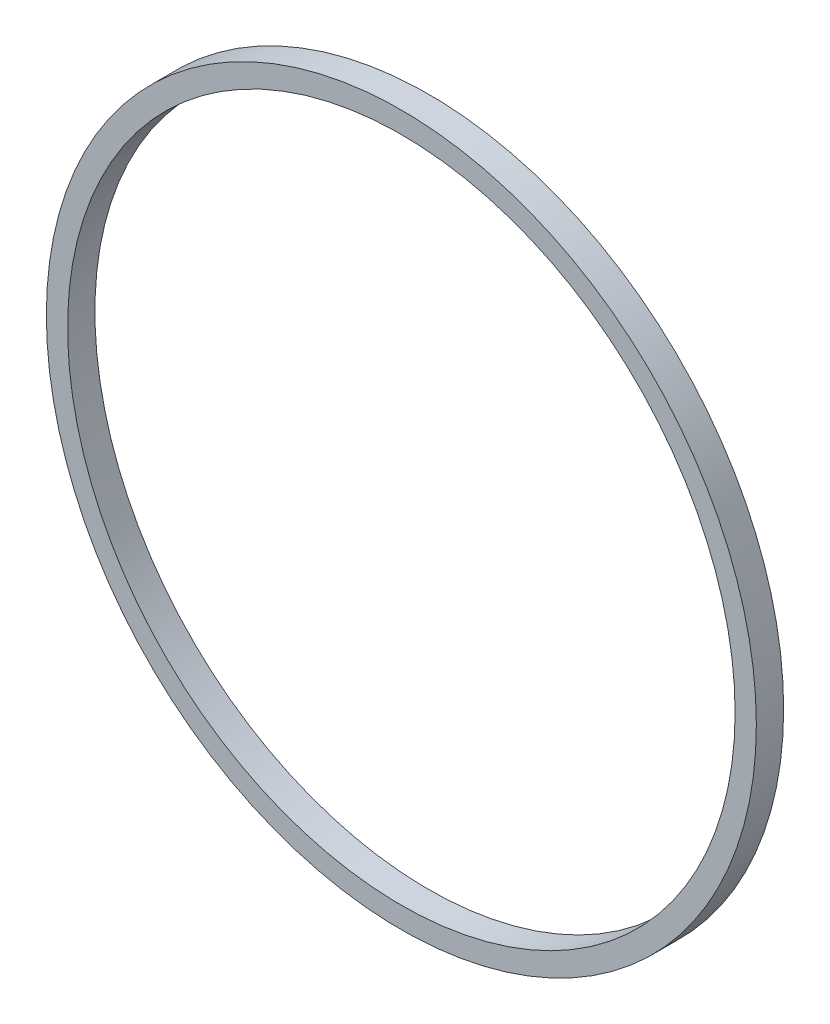
ISO-10303-21;
HEADER;
FILE_DESCRIPTION(('STEP AP214'),'2;1');
FILE_NAME('part.step','',(''),(''),'','','');
FILE_SCHEMA(('AUTOMOTIVE_DESIGN { 1 0 10303 214 1 1 1 1 }'));
ENDSEC;
DATA;
#1=APPLICATION_CONTEXT('core data for automotive mechanical design processes');
#2=APPLICATION_PROTOCOL_DEFINITION('international standard','automotive_design',2000,#1);
#3=PRODUCT_CONTEXT('',#1,'mechanical');
#4=PRODUCT('Part','Part','',(#3));
#5=PRODUCT_RELATED_PRODUCT_CATEGORY('part','',(#4));
#6=PRODUCT_DEFINITION_FORMATION('','',#4);
#7=PRODUCT_DEFINITION_CONTEXT('part definition',#1,'design');
#8=PRODUCT_DEFINITION('design','',#6,#7);
#9=PRODUCT_DEFINITION_SHAPE('','',#8);
#10=(LENGTH_UNIT() NAMED_UNIT(*) SI_UNIT(.MILLI.,.METRE.));
#11=(NAMED_UNIT(*) PLANE_ANGLE_UNIT() SI_UNIT($,.RADIAN.));
#12=(NAMED_UNIT(*) SI_UNIT($,.STERADIAN.) SOLID_ANGLE_UNIT());
#13=UNCERTAINTY_MEASURE_WITH_UNIT(LENGTH_MEASURE(1.E-05),#10,'distance_accuracy_value','');
#14=(GEOMETRIC_REPRESENTATION_CONTEXT(3) GLOBAL_UNCERTAINTY_ASSIGNED_CONTEXT((#13)) GLOBAL_UNIT_ASSIGNED_CONTEXT((#10,
#11,#12)) REPRESENTATION_CONTEXT('',''));
#15=CARTESIAN_POINT('',(0.,0.,0.));
#16=DIRECTION('',(0.,0.,1.));
#17=DIRECTION('',(1.,0.,0.));
#18=AXIS2_PLACEMENT_3D('',#15,#16,#17);
#19=CARTESIAN_POINT('',(57.8749505170549,92.2544483756481,2.25));
#20=DIRECTION('',(0.,0.,-1.));
#21=DIRECTION('',(-1.,0.,0.));
#22=AXIS2_PLACEMENT_3D('',#19,#20,#21);
#23=CYLINDRICAL_SURFACE('',#22,55.);
#24=CARTESIAN_POINT('',(57.8749505170549,92.2544483756481,2.25));
#25=DIRECTION('',(0.,0.,1.));
#26=DIRECTION('',(1.,0.,0.));
#27=AXIS2_PLACEMENT_3D('',#24,#25,#26);
#28=CIRCLE('',#27,55.);
#29=CARTESIAN_POINT('',(112.874950517055,92.2544483756481,2.25));
#30=VERTEX_POINT('',#29);
#31=EDGE_CURVE('E41',#30,#30,#28,.T.);
#32=ORIENTED_EDGE('',*,*,#31,.T.);
#33=EDGE_LOOP('',(#32));
#34=FACE_BOUND('',#33,.T.);
#35=CARTESIAN_POINT('',(57.8749505170549,92.2544483756481,-2.25));
#36=DIRECTION('',(0.,0.,1.));
#37=DIRECTION('',(1.,0.,0.));
#38=AXIS2_PLACEMENT_3D('',#35,#36,#37);
#39=CIRCLE('',#38,55.);
#40=CARTESIAN_POINT('',(112.874950517055,92.2544483756481,-2.25));
#41=VERTEX_POINT('',#40);
#42=EDGE_CURVE('E47',#41,#41,#39,.T.);
#43=ORIENTED_EDGE('',*,*,#42,.F.);
#44=EDGE_LOOP('',(#43));
#45=FACE_BOUND('',#44,.T.);
#46=ADVANCED_FACE('F34',(#34,#45),#23,.F.);
#47=CARTESIAN_POINT('',(57.8749505170549,92.2544483756481,2.25));
#48=DIRECTION('',(0.,0.,-1.));
#49=DIRECTION('',(-1.,0.,0.));
#50=AXIS2_PLACEMENT_3D('',#47,#48,#49);
#51=CYLINDRICAL_SURFACE('',#50,58.5);
#52=CARTESIAN_POINT('',(57.8749505170549,92.2544483756481,2.25));
#53=DIRECTION('',(0.,0.,1.));
#54=DIRECTION('',(1.,0.,0.));
#55=AXIS2_PLACEMENT_3D('',#52,#53,#54);
#56=CIRCLE('',#55,58.5);
#57=CARTESIAN_POINT('',(116.374950517055,92.2544483756481,2.25));
#58=VERTEX_POINT('',#57);
#59=EDGE_CURVE('E10',#58,#58,#56,.T.);
#60=ORIENTED_EDGE('',*,*,#59,.F.);
#61=EDGE_LOOP('',(#60));
#62=FACE_BOUND('',#61,.T.);
#63=CARTESIAN_POINT('',(57.8749505170549,92.2544483756481,-2.25));
#64=DIRECTION('',(0.,0.,1.));
#65=DIRECTION('',(1.,0.,0.));
#66=AXIS2_PLACEMENT_3D('',#63,#64,#65);
#67=CIRCLE('',#66,58.5);
#68=CARTESIAN_POINT('',(116.374950517055,92.2544483756481,-2.25));
#69=VERTEX_POINT('',#68);
#70=EDGE_CURVE('E37',#69,#69,#67,.T.);
#71=ORIENTED_EDGE('',*,*,#70,.T.);
#72=EDGE_LOOP('',(#71));
#73=FACE_BOUND('',#72,.T.);
#74=ADVANCED_FACE('F54',(#62,#73),#51,.T.);
#75=CARTESIAN_POINT('',(0.,0.,2.25));
#76=DIRECTION('',(0.,0.,1.));
#77=DIRECTION('',(1.,0.,0.));
#78=AXIS2_PLACEMENT_3D('',#75,#76,#77);
#79=PLANE('',#78);
#80=ORIENTED_EDGE('',*,*,#31,.F.);
#81=EDGE_LOOP('',(#80));
#82=FACE_BOUND('',#81,.T.);
#83=ORIENTED_EDGE('',*,*,#59,.T.);
#84=EDGE_LOOP('',(#83));
#85=FACE_BOUND('',#84,.T.);
#86=ADVANCED_FACE('F58',(#82,#85),#79,.T.);
#87=CARTESIAN_POINT('',(0.,0.,-2.25));
#88=DIRECTION('',(0.,0.,1.));
#89=DIRECTION('',(1.,0.,0.));
#90=AXIS2_PLACEMENT_3D('',#87,#88,#89);
#91=PLANE('',#90);
#92=ORIENTED_EDGE('',*,*,#42,.T.);
#93=EDGE_LOOP('',(#92));
#94=FACE_BOUND('',#93,.T.);
#95=ORIENTED_EDGE('',*,*,#70,.F.);
#96=EDGE_LOOP('',(#95));
#97=FACE_BOUND('',#96,.T.);
#98=ADVANCED_FACE('F56',(#94,#97),#91,.F.);
#99=CLOSED_SHELL('',(#46,#74,#86,#98));
#100=MANIFOLD_SOLID_BREP('B2',#99);
#101=ADVANCED_BREP_SHAPE_REPRESENTATION('',(#18,#100),#14);
#102=SHAPE_DEFINITION_REPRESENTATION(#9,#101);
ENDSEC;
END-ISO-10303-21;
